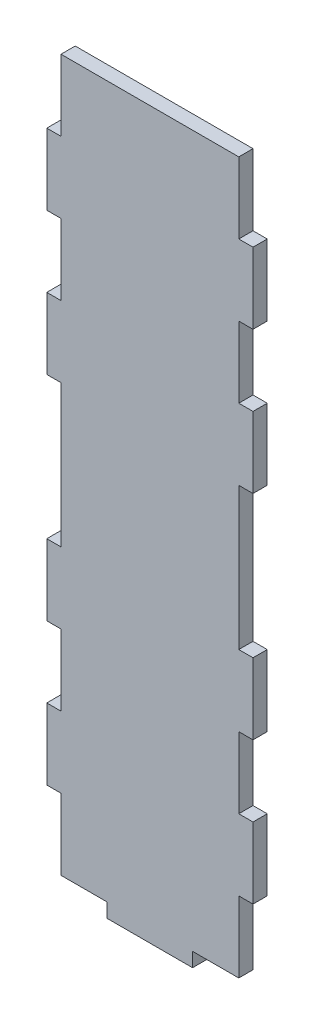
ISO-10303-21;
HEADER;
FILE_DESCRIPTION(('STEP AP214'),'2;1');
FILE_NAME('part.step','',(''),(''),'','','');
FILE_SCHEMA(('AUTOMOTIVE_DESIGN { 1 0 10303 214 1 1 1 1 }'));
ENDSEC;
DATA;
#1=APPLICATION_CONTEXT('core data for automotive mechanical design processes');
#2=APPLICATION_PROTOCOL_DEFINITION('international standard','automotive_design',2000,#1);
#3=PRODUCT_CONTEXT('',#1,'mechanical');
#4=PRODUCT('Part','Part','',(#3));
#5=PRODUCT_RELATED_PRODUCT_CATEGORY('part','',(#4));
#6=PRODUCT_DEFINITION_FORMATION('','',#4);
#7=PRODUCT_DEFINITION_CONTEXT('part definition',#1,'design');
#8=PRODUCT_DEFINITION('design','',#6,#7);
#9=PRODUCT_DEFINITION_SHAPE('','',#8);
#10=(LENGTH_UNIT() NAMED_UNIT(*) SI_UNIT(.MILLI.,.METRE.));
#11=(NAMED_UNIT(*) PLANE_ANGLE_UNIT() SI_UNIT($,.RADIAN.));
#12=(NAMED_UNIT(*) SI_UNIT($,.STERADIAN.) SOLID_ANGLE_UNIT());
#13=UNCERTAINTY_MEASURE_WITH_UNIT(LENGTH_MEASURE(1.E-05),#10,'distance_accuracy_value','');
#14=(GEOMETRIC_REPRESENTATION_CONTEXT(3) GLOBAL_UNCERTAINTY_ASSIGNED_CONTEXT((#13)) GLOBAL_UNIT_ASSIGNED_CONTEXT((#10,
#11,#12)) REPRESENTATION_CONTEXT('',''));
#15=CARTESIAN_POINT('',(0.,0.,0.));
#16=DIRECTION('',(0.,0.,1.));
#17=DIRECTION('',(1.,0.,0.));
#18=AXIS2_PLACEMENT_3D('',#15,#16,#17);
#19=CARTESIAN_POINT('',(-50.,-100.,4.));
#20=DIRECTION('',(1.,0.,0.));
#21=DIRECTION('',(0.,0.,-1.));
#22=AXIS2_PLACEMENT_3D('',#19,#20,#21);
#23=PLANE('',#22);
#24=DIRECTION('',(0.,-1.,0.));
#25=VECTOR('',#24,1.);
#26=CARTESIAN_POINT('',(-50.,-100.,4.));
#27=LINE('',#26,#25);
#28=CARTESIAN_POINT('',(-50.,-40.,4.));
#29=VERTEX_POINT('',#28);
#30=CARTESIAN_POINT('',(-50.,-60.,4.));
#31=VERTEX_POINT('',#30);
#32=EDGE_CURVE('E54',#29,#31,#27,.T.);
#33=ORIENTED_EDGE('',*,*,#32,.F.);
#34=DIRECTION('',(0.,0.,1.));
#35=VECTOR('',#34,1.);
#36=CARTESIAN_POINT('',(-50.,-40.,0.));
#37=LINE('',#36,#35);
#38=CARTESIAN_POINT('',(-50.,-40.,0.));
#39=VERTEX_POINT('',#38);
#40=EDGE_CURVE('E309',#39,#29,#37,.T.);
#41=ORIENTED_EDGE('',*,*,#40,.F.);
#42=DIRECTION('',(0.,-1.,0.));
#43=VECTOR('',#42,1.);
#44=CARTESIAN_POINT('',(-50.,-100.,0.));
#45=LINE('',#44,#43);
#46=CARTESIAN_POINT('',(-50.,-60.,0.));
#47=VERTEX_POINT('',#46);
#48=EDGE_CURVE('E558',#39,#47,#45,.T.);
#49=ORIENTED_EDGE('',*,*,#48,.T.);
#50=DIRECTION('',(0.,0.,1.));
#51=VECTOR('',#50,1.);
#52=CARTESIAN_POINT('',(-50.,-60.,0.));
#53=LINE('',#52,#51);
#54=EDGE_CURVE('E331',#47,#31,#53,.T.);
#55=ORIENTED_EDGE('',*,*,#54,.T.);
#56=EDGE_LOOP('',(#33,#41,#49,#55));
#57=FACE_BOUND('',#56,.T.);
#58=ADVANCED_FACE('F39',(#57),#23,.F.);
#59=CARTESIAN_POINT('',(-50.,-80.,4.));
#60=VERTEX_POINT('',#59);
#61=CARTESIAN_POINT('',(-50.,-100.,4.));
#62=VERTEX_POINT('',#61);
#63=EDGE_CURVE('E533',#60,#62,#27,.T.);
#64=ORIENTED_EDGE('',*,*,#63,.F.);
#65=DIRECTION('',(0.,0.,1.));
#66=VECTOR('',#65,1.);
#67=CARTESIAN_POINT('',(-50.,-80.,0.));
#68=LINE('',#67,#66);
#69=CARTESIAN_POINT('',(-50.,-80.,0.));
#70=VERTEX_POINT('',#69);
#71=EDGE_CURVE('E327',#70,#60,#68,.T.);
#72=ORIENTED_EDGE('',*,*,#71,.F.);
#73=CARTESIAN_POINT('',(-50.,-100.,0.));
#74=VERTEX_POINT('',#73);
#75=EDGE_CURVE('E552',#70,#74,#45,.T.);
#76=ORIENTED_EDGE('',*,*,#75,.T.);
#77=DIRECTION('',(0.,0.,-1.));
#78=VECTOR('',#77,1.);
#79=CARTESIAN_POINT('',(-50.,-100.,4.));
#80=LINE('',#79,#78);
#81=EDGE_CURVE('E47',#62,#74,#80,.T.);
#82=ORIENTED_EDGE('',*,*,#81,.F.);
#83=EDGE_LOOP('',(#64,#72,#76,#82));
#84=FACE_BOUND('',#83,.T.);
#85=ADVANCED_FACE('F635',(#84),#23,.F.);
#86=CARTESIAN_POINT('',(-50.,20.,0.));
#87=VERTEX_POINT('',#86);
#88=CARTESIAN_POINT('',(-50.,-20.,0.));
#89=VERTEX_POINT('',#88);
#90=EDGE_CURVE('E626',#87,#89,#45,.T.);
#91=ORIENTED_EDGE('',*,*,#90,.T.);
#92=DIRECTION('',(0.,0.,1.));
#93=VECTOR('',#92,1.);
#94=CARTESIAN_POINT('',(-50.,-20.,0.));
#95=LINE('',#94,#93);
#96=CARTESIAN_POINT('',(-50.,-20.,4.));
#97=VERTEX_POINT('',#96);
#98=EDGE_CURVE('E62',#89,#97,#95,.T.);
#99=ORIENTED_EDGE('',*,*,#98,.T.);
#100=CARTESIAN_POINT('',(-50.,20.,4.));
#101=VERTEX_POINT('',#100);
#102=EDGE_CURVE('E605',#101,#97,#27,.T.);
#103=ORIENTED_EDGE('',*,*,#102,.F.);
#104=DIRECTION('',(0.,0.,1.));
#105=VECTOR('',#104,1.);
#106=CARTESIAN_POINT('',(-50.,20.,0.));
#107=LINE('',#106,#105);
#108=EDGE_CURVE('E350',#87,#101,#107,.T.);
#109=ORIENTED_EDGE('',*,*,#108,.F.);
#110=EDGE_LOOP('',(#91,#99,#103,#109));
#111=FACE_BOUND('',#110,.T.);
#112=ADVANCED_FACE('F625',(#111),#23,.F.);
#113=CARTESIAN_POINT('',(-50.,60.,0.));
#114=VERTEX_POINT('',#113);
#115=CARTESIAN_POINT('',(-50.,40.,0.));
#116=VERTEX_POINT('',#115);
#117=EDGE_CURVE('E557',#114,#116,#45,.T.);
#118=ORIENTED_EDGE('',*,*,#117,.T.);
#119=DIRECTION('',(0.,0.,1.));
#120=VECTOR('',#119,1.);
#121=CARTESIAN_POINT('',(-50.,40.,0.));
#122=LINE('',#121,#120);
#123=CARTESIAN_POINT('',(-50.,40.,4.));
#124=VERTEX_POINT('',#123);
#125=EDGE_CURVE('E358',#116,#124,#122,.T.);
#126=ORIENTED_EDGE('',*,*,#125,.T.);
#127=CARTESIAN_POINT('',(-50.,60.,4.));
#128=VERTEX_POINT('',#127);
#129=EDGE_CURVE('E539',#128,#124,#27,.T.);
#130=ORIENTED_EDGE('',*,*,#129,.F.);
#131=DIRECTION('',(0.,0.,1.));
#132=VECTOR('',#131,1.);
#133=CARTESIAN_POINT('',(-50.,60.,0.));
#134=LINE('',#133,#132);
#135=EDGE_CURVE('E402',#114,#128,#134,.T.);
#136=ORIENTED_EDGE('',*,*,#135,.F.);
#137=EDGE_LOOP('',(#118,#126,#130,#136));
#138=FACE_BOUND('',#137,.T.);
#139=ADVANCED_FACE('F644',(#138),#23,.F.);
#140=CARTESIAN_POINT('',(-50.,100.,4.));
#141=DIRECTION('',(0.,-1.,0.));
#142=DIRECTION('',(1.,0.,0.));
#143=AXIS2_PLACEMENT_3D('',#140,#141,#142);
#144=PLANE('',#143);
#145=DIRECTION('',(0.,0.,1.));
#146=VECTOR('',#145,1.);
#147=CARTESIAN_POINT('',(0.,100.,0.));
#148=LINE('',#147,#146);
#149=CARTESIAN_POINT('',(0.,100.,0.));
#150=VERTEX_POINT('',#149);
#151=CARTESIAN_POINT('',(0.,100.,4.));
#152=VERTEX_POINT('',#151);
#153=EDGE_CURVE('E511',#150,#152,#148,.T.);
#154=ORIENTED_EDGE('',*,*,#153,.F.);
#155=DIRECTION('',(-1.,0.,0.));
#156=VECTOR('',#155,1.);
#157=CARTESIAN_POINT('',(-50.,100.,0.));
#158=LINE('',#157,#156);
#159=CARTESIAN_POINT('',(-50.,100.,0.));
#160=VERTEX_POINT('',#159);
#161=EDGE_CURVE('E496',#150,#160,#158,.T.);
#162=ORIENTED_EDGE('',*,*,#161,.T.);
#163=DIRECTION('',(0.,0.,-1.));
#164=VECTOR('',#163,1.);
#165=CARTESIAN_POINT('',(-50.,100.,4.));
#166=LINE('',#165,#164);
#167=CARTESIAN_POINT('',(-50.,100.,4.));
#168=VERTEX_POINT('',#167);
#169=EDGE_CURVE('E11',#168,#160,#166,.T.);
#170=ORIENTED_EDGE('',*,*,#169,.F.);
#171=DIRECTION('',(-1.,0.,0.));
#172=VECTOR('',#171,1.);
#173=CARTESIAN_POINT('',(-50.,100.,4.));
#174=LINE('',#173,#172);
#175=EDGE_CURVE('E531',#152,#168,#174,.T.);
#176=ORIENTED_EDGE('',*,*,#175,.F.);
#177=EDGE_LOOP('',(#154,#162,#170,#176));
#178=FACE_BOUND('',#177,.T.);
#179=ADVANCED_FACE('F41',(#178),#144,.F.);
#180=CARTESIAN_POINT('',(-13.,-100.,4.));
#181=DIRECTION('',(0.,1.,0.));
#182=DIRECTION('',(0.,0.,1.));
#183=AXIS2_PLACEMENT_3D('',#180,#181,#182);
#184=PLANE('',#183);
#185=DIRECTION('',(0.,0.,1.));
#186=VECTOR('',#185,1.);
#187=CARTESIAN_POINT('',(0.,-100.,0.));
#188=LINE('',#187,#186);
#189=CARTESIAN_POINT('',(0.,-100.,0.));
#190=VERTEX_POINT('',#189);
#191=CARTESIAN_POINT('',(0.,-100.,4.));
#192=VERTEX_POINT('',#191);
#193=EDGE_CURVE('E513',#190,#192,#188,.T.);
#194=ORIENTED_EDGE('',*,*,#193,.T.);
#195=DIRECTION('',(1.,0.,0.));
#196=VECTOR('',#195,1.);
#197=CARTESIAN_POINT('',(-13.,-100.,4.));
#198=LINE('',#197,#196);
#199=CARTESIAN_POINT('',(-13.,-100.,4.));
#200=VERTEX_POINT('',#199);
#201=EDGE_CURVE('E547',#200,#192,#198,.T.);
#202=ORIENTED_EDGE('',*,*,#201,.F.);
#203=DIRECTION('',(0.,0.,-1.));
#204=VECTOR('',#203,1.);
#205=CARTESIAN_POINT('',(-13.,-100.,4.));
#206=LINE('',#205,#204);
#207=CARTESIAN_POINT('',(-13.,-100.,0.));
#208=VERTEX_POINT('',#207);
#209=EDGE_CURVE('E550',#200,#208,#206,.T.);
#210=ORIENTED_EDGE('',*,*,#209,.T.);
#211=DIRECTION('',(1.,0.,0.));
#212=VECTOR('',#211,1.);
#213=CARTESIAN_POINT('',(-13.,-100.,0.));
#214=LINE('',#213,#212);
#215=EDGE_CURVE('E534',#208,#190,#214,.T.);
#216=ORIENTED_EDGE('',*,*,#215,.T.);
#217=EDGE_LOOP('',(#194,#202,#210,#216));
#218=FACE_BOUND('',#217,.T.);
#219=ADVANCED_FACE('F657',(#218),#184,.F.);
#220=CARTESIAN_POINT('',(0.,0.,4.));
#221=DIRECTION('',(0.,0.,-1.));
#222=DIRECTION('',(-1.,0.,0.));
#223=AXIS2_PLACEMENT_3D('',#220,#221,#222);
#224=PLANE('',#223);
#225=DIRECTION('',(0.,1.,0.));
#226=VECTOR('',#225,1.);
#227=CARTESIAN_POINT('',(0.,0.,4.));
#228=LINE('',#227,#226);
#229=CARTESIAN_POINT('',(0.,80.,4.));
#230=VERTEX_POINT('',#229);
#231=EDGE_CURVE('E455',#230,#152,#228,.T.);
#232=ORIENTED_EDGE('',*,*,#231,.T.);
#233=ORIENTED_EDGE('',*,*,#175,.T.);
#234=CARTESIAN_POINT('',(-50.,80.,4.));
#235=VERTEX_POINT('',#234);
#236=EDGE_CURVE('E535',#168,#235,#27,.T.);
#237=ORIENTED_EDGE('',*,*,#236,.T.);
#238=DIRECTION('',(-1.,0.,0.));
#239=VECTOR('',#238,1.);
#240=CARTESIAN_POINT('',(-50.,80.,4.));
#241=LINE('',#240,#239);
#242=CARTESIAN_POINT('',(-54.,80.,4.));
#243=VERTEX_POINT('',#242);
#244=EDGE_CURVE('E377',#235,#243,#241,.T.);
#245=ORIENTED_EDGE('',*,*,#244,.T.);
#246=DIRECTION('',(0.,-1.,0.));
#247=VECTOR('',#246,1.);
#248=CARTESIAN_POINT('',(-54.,80.,4.));
#249=LINE('',#248,#247);
#250=CARTESIAN_POINT('',(-54.,60.,4.));
#251=VERTEX_POINT('',#250);
#252=EDGE_CURVE('E397',#243,#251,#249,.T.);
#253=ORIENTED_EDGE('',*,*,#252,.T.);
#254=DIRECTION('',(1.,0.,0.));
#255=VECTOR('',#254,1.);
#256=CARTESIAN_POINT('',(-54.,60.,4.));
#257=LINE('',#256,#255);
#258=EDGE_CURVE('E389',#251,#128,#257,.T.);
#259=ORIENTED_EDGE('',*,*,#258,.T.);
#260=ORIENTED_EDGE('',*,*,#129,.T.);
#261=DIRECTION('',(-1.,0.,0.));
#262=VECTOR('',#261,1.);
#263=CARTESIAN_POINT('',(-50.,40.,4.));
#264=LINE('',#263,#262);
#265=CARTESIAN_POINT('',(-54.,40.,4.));
#266=VERTEX_POINT('',#265);
#267=EDGE_CURVE('E374',#124,#266,#264,.T.);
#268=ORIENTED_EDGE('',*,*,#267,.T.);
#269=DIRECTION('',(0.,-1.,0.));
#270=VECTOR('',#269,1.);
#271=CARTESIAN_POINT('',(-54.,40.,4.));
#272=LINE('',#271,#270);
#273=CARTESIAN_POINT('',(-54.,20.,4.));
#274=VERTEX_POINT('',#273);
#275=EDGE_CURVE('E370',#266,#274,#272,.T.);
#276=ORIENTED_EDGE('',*,*,#275,.T.);
#277=DIRECTION('',(1.,0.,0.));
#278=VECTOR('',#277,1.);
#279=CARTESIAN_POINT('',(-54.,20.,4.));
#280=LINE('',#279,#278);
#281=EDGE_CURVE('E367',#274,#101,#280,.T.);
#282=ORIENTED_EDGE('',*,*,#281,.T.);
#283=ORIENTED_EDGE('',*,*,#102,.T.);
#284=DIRECTION('',(-1.,0.,0.));
#285=VECTOR('',#284,1.);
#286=CARTESIAN_POINT('',(-54.,-20.,4.));
#287=LINE('',#286,#285);
#288=CARTESIAN_POINT('',(-54.,-20.,4.));
#289=VERTEX_POINT('',#288);
#290=EDGE_CURVE('E317',#97,#289,#287,.T.);
#291=ORIENTED_EDGE('',*,*,#290,.T.);
#292=DIRECTION('',(0.,-1.,0.));
#293=VECTOR('',#292,1.);
#294=CARTESIAN_POINT('',(-54.,-40.,4.));
#295=LINE('',#294,#293);
#296=CARTESIAN_POINT('',(-54.,-40.,4.));
#297=VERTEX_POINT('',#296);
#298=EDGE_CURVE('E300',#289,#297,#295,.T.);
#299=ORIENTED_EDGE('',*,*,#298,.T.);
#300=DIRECTION('',(1.,0.,0.));
#301=VECTOR('',#300,1.);
#302=CARTESIAN_POINT('',(-50.,-40.,4.));
#303=LINE('',#302,#301);
#304=EDGE_CURVE('E315',#297,#29,#303,.T.);
#305=ORIENTED_EDGE('',*,*,#304,.T.);
#306=ORIENTED_EDGE('',*,*,#32,.T.);
#307=DIRECTION('',(-1.,0.,0.));
#308=VECTOR('',#307,1.);
#309=CARTESIAN_POINT('',(-54.,-60.,4.));
#310=LINE('',#309,#308);
#311=CARTESIAN_POINT('',(-54.,-60.,4.));
#312=VERTEX_POINT('',#311);
#313=EDGE_CURVE('E347',#31,#312,#310,.T.);
#314=ORIENTED_EDGE('',*,*,#313,.T.);
#315=DIRECTION('',(0.,-1.,0.));
#316=VECTOR('',#315,1.);
#317=CARTESIAN_POINT('',(-54.,-80.,4.));
#318=LINE('',#317,#316);
#319=CARTESIAN_POINT('',(-54.,-80.,4.));
#320=VERTEX_POINT('',#319);
#321=EDGE_CURVE('E343',#312,#320,#318,.T.);
#322=ORIENTED_EDGE('',*,*,#321,.T.);
#323=DIRECTION('',(1.,0.,0.));
#324=VECTOR('',#323,1.);
#325=CARTESIAN_POINT('',(-50.,-80.,4.));
#326=LINE('',#325,#324);
#327=EDGE_CURVE('E340',#320,#60,#326,.T.);
#328=ORIENTED_EDGE('',*,*,#327,.T.);
#329=ORIENTED_EDGE('',*,*,#63,.T.);
#330=DIRECTION('',(1.,0.,0.));
#331=VECTOR('',#330,1.);
#332=CARTESIAN_POINT('',(-50.,-100.,4.));
#333=LINE('',#332,#331);
#334=CARTESIAN_POINT('',(-37.,-100.,4.));
#335=VERTEX_POINT('',#334);
#336=EDGE_CURVE('E538',#62,#335,#333,.T.);
#337=ORIENTED_EDGE('',*,*,#336,.T.);
#338=DIRECTION('',(0.,-1.,0.));
#339=VECTOR('',#338,1.);
#340=CARTESIAN_POINT('',(-37.,-100.,4.));
#341=LINE('',#340,#339);
#342=CARTESIAN_POINT('',(-37.,-104.,4.));
#343=VERTEX_POINT('',#342);
#344=EDGE_CURVE('E541',#335,#343,#341,.T.);
#345=ORIENTED_EDGE('',*,*,#344,.T.);
#346=DIRECTION('',(1.,0.,0.));
#347=VECTOR('',#346,1.);
#348=CARTESIAN_POINT('',(-37.,-104.,4.));
#349=LINE('',#348,#347);
#350=CARTESIAN_POINT('',(-13.,-104.,4.));
#351=VERTEX_POINT('',#350);
#352=EDGE_CURVE('E543',#343,#351,#349,.T.);
#353=ORIENTED_EDGE('',*,*,#352,.T.);
#354=DIRECTION('',(0.,1.,0.));
#355=VECTOR('',#354,1.);
#356=CARTESIAN_POINT('',(-13.,-104.,4.));
#357=LINE('',#356,#355);
#358=EDGE_CURVE('E545',#351,#200,#357,.T.);
#359=ORIENTED_EDGE('',*,*,#358,.T.);
#360=ORIENTED_EDGE('',*,*,#201,.T.);
#361=DIRECTION('',(0.,1.,0.));
#362=VECTOR('',#361,1.);
#363=CARTESIAN_POINT('',(0.,0.,4.));
#364=LINE('',#363,#362);
#365=CARTESIAN_POINT('',(0.,-80.,4.));
#366=VERTEX_POINT('',#365);
#367=EDGE_CURVE('E468',#192,#366,#364,.T.);
#368=ORIENTED_EDGE('',*,*,#367,.T.);
#369=DIRECTION('',(1.,0.,0.));
#370=VECTOR('',#369,1.);
#371=CARTESIAN_POINT('',(0.,-80.,4.));
#372=LINE('',#371,#370);
#373=CARTESIAN_POINT('',(4.00000000000003,-80.,4.));
#374=VERTEX_POINT('',#373);
#375=EDGE_CURVE('E474',#366,#374,#372,.T.);
#376=ORIENTED_EDGE('',*,*,#375,.T.);
#377=DIRECTION('',(0.,1.,0.));
#378=VECTOR('',#377,1.);
#379=CARTESIAN_POINT('',(3.99999999999998,0.,4.));
#380=LINE('',#379,#378);
#381=CARTESIAN_POINT('',(4.00000000000002,-60.,4.));
#382=VERTEX_POINT('',#381);
#383=EDGE_CURVE('E471',#374,#382,#380,.T.);
#384=ORIENTED_EDGE('',*,*,#383,.T.);
#385=DIRECTION('',(-1.,0.,0.));
#386=VECTOR('',#385,1.);
#387=CARTESIAN_POINT('',(0.,-60.,4.));
#388=LINE('',#387,#386);
#389=CARTESIAN_POINT('',(0.,-60.,4.));
#390=VERTEX_POINT('',#389);
#391=EDGE_CURVE('E467',#382,#390,#388,.T.);
#392=ORIENTED_EDGE('',*,*,#391,.T.);
#393=CARTESIAN_POINT('',(0.,-40.,4.));
#394=VERTEX_POINT('',#393);
#395=EDGE_CURVE('E464',#390,#394,#364,.T.);
#396=ORIENTED_EDGE('',*,*,#395,.T.);
#397=DIRECTION('',(1.,0.,0.));
#398=VECTOR('',#397,1.);
#399=CARTESIAN_POINT('',(0.,-40.,4.));
#400=LINE('',#399,#398);
#401=CARTESIAN_POINT('',(4.00000000000002,-40.,4.));
#402=VERTEX_POINT('',#401);
#403=EDGE_CURVE('E461',#394,#402,#400,.T.);
#404=ORIENTED_EDGE('',*,*,#403,.T.);
#405=DIRECTION('',(0.,1.,0.));
#406=VECTOR('',#405,1.);
#407=CARTESIAN_POINT('',(4.,0.,4.));
#408=LINE('',#407,#406);
#409=CARTESIAN_POINT('',(4.00000000000001,-20.,4.));
#410=VERTEX_POINT('',#409);
#411=EDGE_CURVE('E458',#402,#410,#408,.T.);
#412=ORIENTED_EDGE('',*,*,#411,.T.);
#413=DIRECTION('',(-1.,0.,0.));
#414=VECTOR('',#413,1.);
#415=CARTESIAN_POINT('',(0.,-20.,4.));
#416=LINE('',#415,#414);
#417=CARTESIAN_POINT('',(0.,-20.,4.));
#418=VERTEX_POINT('',#417);
#419=EDGE_CURVE('E453',#410,#418,#416,.T.);
#420=ORIENTED_EDGE('',*,*,#419,.T.);
#421=CARTESIAN_POINT('',(0.,20.,4.));
#422=VERTEX_POINT('',#421);
#423=EDGE_CURVE('E404',#418,#422,#228,.T.);
#424=ORIENTED_EDGE('',*,*,#423,.T.);
#425=DIRECTION('',(-1.,0.,0.));
#426=VECTOR('',#425,1.);
#427=CARTESIAN_POINT('',(0.,20.,4.));
#428=LINE('',#427,#426);
#429=CARTESIAN_POINT('',(4.00000000000001,20.,4.));
#430=VERTEX_POINT('',#429);
#431=EDGE_CURVE('E414',#430,#422,#428,.T.);
#432=ORIENTED_EDGE('',*,*,#431,.F.);
#433=DIRECTION('',(0.,-1.,0.));
#434=VECTOR('',#433,1.);
#435=CARTESIAN_POINT('',(4.00000000000001,0.,4.));
#436=LINE('',#435,#434);
#437=CARTESIAN_POINT('',(4.00000000000001,40.,4.));
#438=VERTEX_POINT('',#437);
#439=EDGE_CURVE('E489',#438,#430,#436,.T.);
#440=ORIENTED_EDGE('',*,*,#439,.F.);
#441=DIRECTION('',(1.,0.,0.));
#442=VECTOR('',#441,1.);
#443=CARTESIAN_POINT('',(0.,40.,4.));
#444=LINE('',#443,#442);
#445=CARTESIAN_POINT('',(0.,40.,4.));
#446=VERTEX_POINT('',#445);
#447=EDGE_CURVE('E486',#446,#438,#444,.T.);
#448=ORIENTED_EDGE('',*,*,#447,.F.);
#449=CARTESIAN_POINT('',(0.,60.,4.));
#450=VERTEX_POINT('',#449);
#451=EDGE_CURVE('E454',#446,#450,#228,.T.);
#452=ORIENTED_EDGE('',*,*,#451,.T.);
#453=DIRECTION('',(-1.,0.,0.));
#454=VECTOR('',#453,1.);
#455=CARTESIAN_POINT('',(0.,60.,4.));
#456=LINE('',#455,#454);
#457=CARTESIAN_POINT('',(4.,60.,4.));
#458=VERTEX_POINT('',#457);
#459=EDGE_CURVE('E483',#458,#450,#456,.T.);
#460=ORIENTED_EDGE('',*,*,#459,.F.);
#461=DIRECTION('',(0.,-1.,0.));
#462=VECTOR('',#461,1.);
#463=CARTESIAN_POINT('',(4.00000000000001,0.,4.));
#464=LINE('',#463,#462);
#465=CARTESIAN_POINT('',(4.,80.,4.));
#466=VERTEX_POINT('',#465);
#467=EDGE_CURVE('E480',#466,#458,#464,.T.);
#468=ORIENTED_EDGE('',*,*,#467,.F.);
#469=DIRECTION('',(1.,0.,0.));
#470=VECTOR('',#469,1.);
#471=CARTESIAN_POINT('',(0.,80.,4.));
#472=LINE('',#471,#470);
#473=EDGE_CURVE('E477',#230,#466,#472,.T.);
#474=ORIENTED_EDGE('',*,*,#473,.F.);
#475=EDGE_LOOP('',(#232,#233,#237,#245,#253,#259,#260,#268,#276,#282,#283,#291,#299,#305,#306,
#314,#322,#328,#329,#337,#345,#353,#359,#360,#368,#376,#384,#392,#396,#404,#412,#420,#424,#432,
#440,#448,#452,#460,#468,#474));
#476=FACE_BOUND('',#475,.T.);
#477=ADVANCED_FACE('F314',(#476),#224,.F.);
#478=CARTESIAN_POINT('',(0.,0.,0.));
#479=DIRECTION('',(0.,0.,-1.));
#480=DIRECTION('',(-1.,0.,0.));
#481=AXIS2_PLACEMENT_3D('',#478,#479,#480);
#482=PLANE('',#481);
#483=ORIENTED_EDGE('',*,*,#161,.F.);
#484=DIRECTION('',(0.,1.,0.));
#485=VECTOR('',#484,1.);
#486=CARTESIAN_POINT('',(0.,0.,0.));
#487=LINE('',#486,#485);
#488=CARTESIAN_POINT('',(0.,80.,0.));
#489=VERTEX_POINT('',#488);
#490=EDGE_CURVE('E416',#489,#150,#487,.T.);
#491=ORIENTED_EDGE('',*,*,#490,.F.);
#492=DIRECTION('',(1.,0.,0.));
#493=VECTOR('',#492,1.);
#494=CARTESIAN_POINT('',(0.,80.,0.));
#495=LINE('',#494,#493);
#496=CARTESIAN_POINT('',(4.,80.,0.));
#497=VERTEX_POINT('',#496);
#498=EDGE_CURVE('E432',#489,#497,#495,.T.);
#499=ORIENTED_EDGE('',*,*,#498,.T.);
#500=DIRECTION('',(0.,-1.,0.));
#501=VECTOR('',#500,1.);
#502=CARTESIAN_POINT('',(4.00000000000001,0.,0.));
#503=LINE('',#502,#501);
#504=CARTESIAN_POINT('',(4.,60.,0.));
#505=VERTEX_POINT('',#504);
#506=EDGE_CURVE('E435',#497,#505,#503,.T.);
#507=ORIENTED_EDGE('',*,*,#506,.T.);
#508=DIRECTION('',(-1.,0.,0.));
#509=VECTOR('',#508,1.);
#510=CARTESIAN_POINT('',(0.,60.,0.));
#511=LINE('',#510,#509);
#512=CARTESIAN_POINT('',(0.,60.,0.));
#513=VERTEX_POINT('',#512);
#514=EDGE_CURVE('E438',#505,#513,#511,.T.);
#515=ORIENTED_EDGE('',*,*,#514,.T.);
#516=CARTESIAN_POINT('',(0.,40.,0.));
#517=VERTEX_POINT('',#516);
#518=EDGE_CURVE('E415',#517,#513,#487,.T.);
#519=ORIENTED_EDGE('',*,*,#518,.F.);
#520=DIRECTION('',(1.,0.,0.));
#521=VECTOR('',#520,1.);
#522=CARTESIAN_POINT('',(0.,40.,0.));
#523=LINE('',#522,#521);
#524=CARTESIAN_POINT('',(4.00000000000001,40.,0.));
#525=VERTEX_POINT('',#524);
#526=EDGE_CURVE('E441',#517,#525,#523,.T.);
#527=ORIENTED_EDGE('',*,*,#526,.T.);
#528=DIRECTION('',(0.,-1.,0.));
#529=VECTOR('',#528,1.);
#530=CARTESIAN_POINT('',(4.00000000000001,0.,0.));
#531=LINE('',#530,#529);
#532=CARTESIAN_POINT('',(4.00000000000001,20.,0.));
#533=VERTEX_POINT('',#532);
#534=EDGE_CURVE('E444',#525,#533,#531,.T.);
#535=ORIENTED_EDGE('',*,*,#534,.T.);
#536=DIRECTION('',(-1.,0.,0.));
#537=VECTOR('',#536,1.);
#538=CARTESIAN_POINT('',(0.,20.,0.));
#539=LINE('',#538,#537);
#540=CARTESIAN_POINT('',(0.,20.,0.));
#541=VERTEX_POINT('',#540);
#542=EDGE_CURVE('E447',#533,#541,#539,.T.);
#543=ORIENTED_EDGE('',*,*,#542,.T.);
#544=CARTESIAN_POINT('',(0.,-20.,0.));
#545=VERTEX_POINT('',#544);
#546=EDGE_CURVE('E411',#545,#541,#487,.T.);
#547=ORIENTED_EDGE('',*,*,#546,.F.);
#548=DIRECTION('',(-1.,0.,0.));
#549=VECTOR('',#548,1.);
#550=CARTESIAN_POINT('',(0.,-20.,0.));
#551=LINE('',#550,#549);
#552=CARTESIAN_POINT('',(4.00000000000001,-20.,0.));
#553=VERTEX_POINT('',#552);
#554=EDGE_CURVE('E413',#553,#545,#551,.T.);
#555=ORIENTED_EDGE('',*,*,#554,.F.);
#556=DIRECTION('',(0.,1.,0.));
#557=VECTOR('',#556,1.);
#558=CARTESIAN_POINT('',(4.,0.,0.));
#559=LINE('',#558,#557);
#560=CARTESIAN_POINT('',(4.00000000000002,-40.,0.));
#561=VERTEX_POINT('',#560);
#562=EDGE_CURVE('E418',#561,#553,#559,.T.);
#563=ORIENTED_EDGE('',*,*,#562,.F.);
#564=DIRECTION('',(1.,0.,0.));
#565=VECTOR('',#564,1.);
#566=CARTESIAN_POINT('',(0.,-40.,0.));
#567=LINE('',#566,#565);
#568=CARTESIAN_POINT('',(0.,-40.,0.));
#569=VERTEX_POINT('',#568);
#570=EDGE_CURVE('E421',#569,#561,#567,.T.);
#571=ORIENTED_EDGE('',*,*,#570,.F.);
#572=DIRECTION('',(0.,1.,0.));
#573=VECTOR('',#572,1.);
#574=CARTESIAN_POINT('',(0.,0.,0.));
#575=LINE('',#574,#573);
#576=CARTESIAN_POINT('',(0.,-60.,0.));
#577=VERTEX_POINT('',#576);
#578=EDGE_CURVE('E423',#577,#569,#575,.T.);
#579=ORIENTED_EDGE('',*,*,#578,.F.);
#580=DIRECTION('',(-1.,0.,0.));
#581=VECTOR('',#580,1.);
#582=CARTESIAN_POINT('',(0.,-60.,0.));
#583=LINE('',#582,#581);
#584=CARTESIAN_POINT('',(4.00000000000002,-60.,0.));
#585=VERTEX_POINT('',#584);
#586=EDGE_CURVE('E425',#585,#577,#583,.T.);
#587=ORIENTED_EDGE('',*,*,#586,.F.);
#588=DIRECTION('',(0.,1.,0.));
#589=VECTOR('',#588,1.);
#590=CARTESIAN_POINT('',(3.99999999999998,0.,0.));
#591=LINE('',#590,#589);
#592=CARTESIAN_POINT('',(4.00000000000003,-80.,0.));
#593=VERTEX_POINT('',#592);
#594=EDGE_CURVE('E428',#593,#585,#591,.T.);
#595=ORIENTED_EDGE('',*,*,#594,.F.);
#596=DIRECTION('',(1.,0.,0.));
#597=VECTOR('',#596,1.);
#598=CARTESIAN_POINT('',(0.,-80.,0.));
#599=LINE('',#598,#597);
#600=CARTESIAN_POINT('',(0.,-80.,0.));
#601=VERTEX_POINT('',#600);
#602=EDGE_CURVE('E430',#601,#593,#599,.T.);
#603=ORIENTED_EDGE('',*,*,#602,.F.);
#604=EDGE_CURVE('E426',#190,#601,#575,.T.);
#605=ORIENTED_EDGE('',*,*,#604,.F.);
#606=ORIENTED_EDGE('',*,*,#215,.F.);
#607=DIRECTION('',(0.,1.,0.));
#608=VECTOR('',#607,1.);
#609=CARTESIAN_POINT('',(-13.,-104.,0.));
#610=LINE('',#609,#608);
#611=CARTESIAN_POINT('',(-13.,-104.,0.));
#612=VERTEX_POINT('',#611);
#613=EDGE_CURVE('E564',#612,#208,#610,.T.);
#614=ORIENTED_EDGE('',*,*,#613,.F.);
#615=DIRECTION('',(1.,0.,0.));
#616=VECTOR('',#615,1.);
#617=CARTESIAN_POINT('',(-37.,-104.,0.));
#618=LINE('',#617,#616);
#619=CARTESIAN_POINT('',(-37.,-104.,0.));
#620=VERTEX_POINT('',#619);
#621=EDGE_CURVE('E562',#620,#612,#618,.T.);
#622=ORIENTED_EDGE('',*,*,#621,.F.);
#623=DIRECTION('',(0.,-1.,0.));
#624=VECTOR('',#623,1.);
#625=CARTESIAN_POINT('',(-37.,-100.,0.));
#626=LINE('',#625,#624);
#627=CARTESIAN_POINT('',(-37.,-100.,0.));
#628=VERTEX_POINT('',#627);
#629=EDGE_CURVE('E560',#628,#620,#626,.T.);
#630=ORIENTED_EDGE('',*,*,#629,.F.);
#631=DIRECTION('',(1.,0.,0.));
#632=VECTOR('',#631,1.);
#633=CARTESIAN_POINT('',(-50.,-100.,0.));
#634=LINE('',#633,#632);
#635=EDGE_CURVE('E556',#74,#628,#634,.T.);
#636=ORIENTED_EDGE('',*,*,#635,.F.);
#637=ORIENTED_EDGE('',*,*,#75,.F.);
#638=DIRECTION('',(1.,0.,0.));
#639=VECTOR('',#638,1.);
#640=CARTESIAN_POINT('',(-50.,-80.,0.));
#641=LINE('',#640,#639);
#642=CARTESIAN_POINT('',(-54.,-80.,0.));
#643=VERTEX_POINT('',#642);
#644=EDGE_CURVE('E333',#643,#70,#641,.T.);
#645=ORIENTED_EDGE('',*,*,#644,.F.);
#646=DIRECTION('',(0.,-1.,0.));
#647=VECTOR('',#646,1.);
#648=CARTESIAN_POINT('',(-54.,-80.,0.));
#649=LINE('',#648,#647);
#650=CARTESIAN_POINT('',(-54.,-60.,0.));
#651=VERTEX_POINT('',#650);
#652=EDGE_CURVE('E353',#651,#643,#649,.T.);
#653=ORIENTED_EDGE('',*,*,#652,.F.);
#654=DIRECTION('',(-1.,0.,0.));
#655=VECTOR('',#654,1.);
#656=CARTESIAN_POINT('',(-54.,-60.,0.));
#657=LINE('',#656,#655);
#658=EDGE_CURVE('E344',#47,#651,#657,.T.);
#659=ORIENTED_EDGE('',*,*,#658,.F.);
#660=ORIENTED_EDGE('',*,*,#48,.F.);
#661=DIRECTION('',(1.,0.,0.));
#662=VECTOR('',#661,1.);
#663=CARTESIAN_POINT('',(-50.,-40.,0.));
#664=LINE('',#663,#662);
#665=CARTESIAN_POINT('',(-54.,-40.,0.));
#666=VERTEX_POINT('',#665);
#667=EDGE_CURVE('E328',#666,#39,#664,.T.);
#668=ORIENTED_EDGE('',*,*,#667,.F.);
#669=DIRECTION('',(0.,-1.,0.));
#670=VECTOR('',#669,1.);
#671=CARTESIAN_POINT('',(-54.,-40.,0.));
#672=LINE('',#671,#670);
#673=CARTESIAN_POINT('',(-54.,-20.,0.));
#674=VERTEX_POINT('',#673);
#675=EDGE_CURVE('E303',#674,#666,#672,.T.);
#676=ORIENTED_EDGE('',*,*,#675,.F.);
#677=DIRECTION('',(-1.,0.,0.));
#678=VECTOR('',#677,1.);
#679=CARTESIAN_POINT('',(-54.,-20.,0.));
#680=LINE('',#679,#678);
#681=EDGE_CURVE('E320',#89,#674,#680,.T.);
#682=ORIENTED_EDGE('',*,*,#681,.F.);
#683=ORIENTED_EDGE('',*,*,#90,.F.);
#684=DIRECTION('',(1.,0.,0.));
#685=VECTOR('',#684,1.);
#686=CARTESIAN_POINT('',(-54.,20.,0.));
#687=LINE('',#686,#685);
#688=CARTESIAN_POINT('',(-54.,20.,0.));
#689=VERTEX_POINT('',#688);
#690=EDGE_CURVE('E360',#689,#87,#687,.T.);
#691=ORIENTED_EDGE('',*,*,#690,.F.);
#692=DIRECTION('',(0.,-1.,0.));
#693=VECTOR('',#692,1.);
#694=CARTESIAN_POINT('',(-54.,40.,0.));
#695=LINE('',#694,#693);
#696=CARTESIAN_POINT('',(-54.,40.,0.));
#697=VERTEX_POINT('',#696);
#698=EDGE_CURVE('E380',#697,#689,#695,.T.);
#699=ORIENTED_EDGE('',*,*,#698,.F.);
#700=DIRECTION('',(-1.,0.,0.));
#701=VECTOR('',#700,1.);
#702=CARTESIAN_POINT('',(-50.,40.,0.));
#703=LINE('',#702,#701);
#704=EDGE_CURVE('E371',#116,#697,#703,.T.);
#705=ORIENTED_EDGE('',*,*,#704,.F.);
#706=ORIENTED_EDGE('',*,*,#117,.F.);
#707=DIRECTION('',(1.,0.,0.));
#708=VECTOR('',#707,1.);
#709=CARTESIAN_POINT('',(-54.,60.,0.));
#710=LINE('',#709,#708);
#711=CARTESIAN_POINT('',(-54.,60.,0.));
#712=VERTEX_POINT('',#711);
#713=EDGE_CURVE('E392',#712,#114,#710,.T.);
#714=ORIENTED_EDGE('',*,*,#713,.F.);
#715=DIRECTION('',(0.,-1.,0.));
#716=VECTOR('',#715,1.);
#717=CARTESIAN_POINT('',(-54.,80.,0.));
#718=LINE('',#717,#716);
#719=CARTESIAN_POINT('',(-54.,80.,0.));
#720=VERTEX_POINT('',#719);
#721=EDGE_CURVE('E388',#720,#712,#718,.T.);
#722=ORIENTED_EDGE('',*,*,#721,.F.);
#723=DIRECTION('',(-1.,0.,0.));
#724=VECTOR('',#723,1.);
#725=CARTESIAN_POINT('',(-50.,80.,0.));
#726=LINE('',#725,#724);
#727=CARTESIAN_POINT('',(-50.,80.,0.));
#728=VERTEX_POINT('',#727);
#729=EDGE_CURVE('E385',#728,#720,#726,.T.);
#730=ORIENTED_EDGE('',*,*,#729,.F.);
#731=EDGE_CURVE('E553',#160,#728,#45,.T.);
#732=ORIENTED_EDGE('',*,*,#731,.F.);
#733=EDGE_LOOP('',(#483,#491,#499,#507,#515,#519,#527,#535,#543,#547,#555,#563,#571,#579,#587,
#595,#603,#605,#606,#614,#622,#630,#636,#637,#645,#653,#659,#660,#668,#676,#682,#683,#691,#699,
#705,#706,#714,#722,#730,#732));
#734=FACE_BOUND('',#733,.T.);
#735=ADVANCED_FACE('F589',(#734),#482,.T.);
#736=ORIENTED_EDGE('',*,*,#731,.T.);
#737=DIRECTION('',(0.,0.,1.));
#738=VECTOR('',#737,1.);
#739=CARTESIAN_POINT('',(-50.,80.,0.));
#740=LINE('',#739,#738);
#741=EDGE_CURVE('E394',#728,#235,#740,.T.);
#742=ORIENTED_EDGE('',*,*,#741,.T.);
#743=ORIENTED_EDGE('',*,*,#236,.F.);
#744=ORIENTED_EDGE('',*,*,#169,.T.);
#745=EDGE_LOOP('',(#736,#742,#743,#744));
#746=FACE_BOUND('',#745,.T.);
#747=ADVANCED_FACE('F636',(#746),#23,.F.);
#748=CARTESIAN_POINT('',(-50.,-100.,4.));
#749=DIRECTION('',(0.,1.,0.));
#750=DIRECTION('',(0.,0.,1.));
#751=AXIS2_PLACEMENT_3D('',#748,#749,#750);
#752=PLANE('',#751);
#753=ORIENTED_EDGE('',*,*,#635,.T.);
#754=DIRECTION('',(0.,0.,-1.));
#755=VECTOR('',#754,1.);
#756=CARTESIAN_POINT('',(-37.,-100.,4.));
#757=LINE('',#756,#755);
#758=EDGE_CURVE('E576',#335,#628,#757,.T.);
#759=ORIENTED_EDGE('',*,*,#758,.F.);
#760=ORIENTED_EDGE('',*,*,#336,.F.);
#761=ORIENTED_EDGE('',*,*,#81,.T.);
#762=EDGE_LOOP('',(#753,#759,#760,#761));
#763=FACE_BOUND('',#762,.T.);
#764=ADVANCED_FACE('F583',(#763),#752,.F.);
#765=CARTESIAN_POINT('',(-37.,-100.,4.));
#766=DIRECTION('',(1.,0.,0.));
#767=DIRECTION('',(0.,1.,0.));
#768=AXIS2_PLACEMENT_3D('',#765,#766,#767);
#769=PLANE('',#768);
#770=ORIENTED_EDGE('',*,*,#629,.T.);
#771=DIRECTION('',(0.,0.,-1.));
#772=VECTOR('',#771,1.);
#773=CARTESIAN_POINT('',(-37.,-104.,4.));
#774=LINE('',#773,#772);
#775=EDGE_CURVE('E573',#343,#620,#774,.T.);
#776=ORIENTED_EDGE('',*,*,#775,.F.);
#777=ORIENTED_EDGE('',*,*,#344,.F.);
#778=ORIENTED_EDGE('',*,*,#758,.T.);
#779=EDGE_LOOP('',(#770,#776,#777,#778));
#780=FACE_BOUND('',#779,.T.);
#781=ADVANCED_FACE('F596',(#780),#769,.F.);
#782=CARTESIAN_POINT('',(-37.,-104.,4.));
#783=DIRECTION('',(0.,1.,0.));
#784=DIRECTION('',(0.,0.,1.));
#785=AXIS2_PLACEMENT_3D('',#782,#783,#784);
#786=PLANE('',#785);
#787=ORIENTED_EDGE('',*,*,#621,.T.);
#788=DIRECTION('',(0.,0.,-1.));
#789=VECTOR('',#788,1.);
#790=CARTESIAN_POINT('',(-13.,-104.,4.));
#791=LINE('',#790,#789);
#792=EDGE_CURVE('E570',#351,#612,#791,.T.);
#793=ORIENTED_EDGE('',*,*,#792,.F.);
#794=ORIENTED_EDGE('',*,*,#352,.F.);
#795=ORIENTED_EDGE('',*,*,#775,.T.);
#796=EDGE_LOOP('',(#787,#793,#794,#795));
#797=FACE_BOUND('',#796,.T.);
#798=ADVANCED_FACE('F600',(#797),#786,.F.);
#799=CARTESIAN_POINT('',(-13.,-104.,4.));
#800=DIRECTION('',(-1.,0.,0.));
#801=DIRECTION('',(0.,0.,1.));
#802=AXIS2_PLACEMENT_3D('',#799,#800,#801);
#803=PLANE('',#802);
#804=ORIENTED_EDGE('',*,*,#613,.T.);
#805=ORIENTED_EDGE('',*,*,#209,.F.);
#806=ORIENTED_EDGE('',*,*,#358,.F.);
#807=ORIENTED_EDGE('',*,*,#792,.T.);
#808=EDGE_LOOP('',(#804,#805,#806,#807));
#809=FACE_BOUND('',#808,.T.);
#810=ADVANCED_FACE('F788',(#809),#803,.F.);
#811=CARTESIAN_POINT('',(0.,0.,0.));
#812=DIRECTION('',(1.,0.,0.));
#813=DIRECTION('',(0.,1.,0.));
#814=AXIS2_PLACEMENT_3D('',#811,#812,#813);
#815=PLANE('',#814);
#816=ORIENTED_EDGE('',*,*,#423,.F.);
#817=DIRECTION('',(0.,0.,1.));
#818=VECTOR('',#817,1.);
#819=CARTESIAN_POINT('',(0.,-20.,0.));
#820=LINE('',#819,#818);
#821=EDGE_CURVE('E450',#545,#418,#820,.T.);
#822=ORIENTED_EDGE('',*,*,#821,.F.);
#823=ORIENTED_EDGE('',*,*,#546,.T.);
#824=DIRECTION('',(0.,0.,1.));
#825=VECTOR('',#824,1.);
#826=CARTESIAN_POINT('',(0.,20.,0.));
#827=LINE('',#826,#825);
#828=EDGE_CURVE('E494',#541,#422,#827,.T.);
#829=ORIENTED_EDGE('',*,*,#828,.T.);
#830=EDGE_LOOP('',(#816,#822,#823,#829));
#831=FACE_BOUND('',#830,.T.);
#832=ADVANCED_FACE('F742',(#831),#815,.T.);
#833=CARTESIAN_POINT('',(0.,20.,0.));
#834=DIRECTION('',(0.,1.,0.));
#835=DIRECTION('',(0.,0.,1.));
#836=AXIS2_PLACEMENT_3D('',#833,#834,#835);
#837=PLANE('',#836);
#838=ORIENTED_EDGE('',*,*,#431,.T.);
#839=ORIENTED_EDGE('',*,*,#828,.F.);
#840=ORIENTED_EDGE('',*,*,#542,.F.);
#841=DIRECTION('',(0.,0.,1.));
#842=VECTOR('',#841,1.);
#843=CARTESIAN_POINT('',(4.00000000000001,20.,0.));
#844=LINE('',#843,#842);
#845=EDGE_CURVE('E497',#533,#430,#844,.T.);
#846=ORIENTED_EDGE('',*,*,#845,.T.);
#847=EDGE_LOOP('',(#838,#839,#840,#846));
#848=FACE_BOUND('',#847,.T.);
#849=ADVANCED_FACE('F746',(#848),#837,.F.);
#850=CARTESIAN_POINT('',(4.00000000000001,0.,0.));
#851=DIRECTION('',(-1.,0.,0.));
#852=DIRECTION('',(0.,-1.,0.));
#853=AXIS2_PLACEMENT_3D('',#850,#851,#852);
#854=PLANE('',#853);
#855=ORIENTED_EDGE('',*,*,#439,.T.);
#856=ORIENTED_EDGE('',*,*,#845,.F.);
#857=ORIENTED_EDGE('',*,*,#534,.F.);
#858=DIRECTION('',(0.,0.,1.));
#859=VECTOR('',#858,1.);
#860=CARTESIAN_POINT('',(4.00000000000001,40.,0.));
#861=LINE('',#860,#859);
#862=EDGE_CURVE('E499',#525,#438,#861,.T.);
#863=ORIENTED_EDGE('',*,*,#862,.T.);
#864=EDGE_LOOP('',(#855,#856,#857,#863));
#865=FACE_BOUND('',#864,.T.);
#866=ADVANCED_FACE('F750',(#865),#854,.F.);
#867=CARTESIAN_POINT('',(0.,40.,0.));
#868=DIRECTION('',(0.,-1.,0.));
#869=DIRECTION('',(0.,0.,-1.));
#870=AXIS2_PLACEMENT_3D('',#867,#868,#869);
#871=PLANE('',#870);
#872=ORIENTED_EDGE('',*,*,#447,.T.);
#873=ORIENTED_EDGE('',*,*,#862,.F.);
#874=ORIENTED_EDGE('',*,*,#526,.F.);
#875=DIRECTION('',(0.,0.,1.));
#876=VECTOR('',#875,1.);
#877=CARTESIAN_POINT('',(0.,40.,0.));
#878=LINE('',#877,#876);
#879=EDGE_CURVE('E501',#517,#446,#878,.T.);
#880=ORIENTED_EDGE('',*,*,#879,.T.);
#881=EDGE_LOOP('',(#872,#873,#874,#880));
#882=FACE_BOUND('',#881,.T.);
#883=ADVANCED_FACE('F752',(#882),#871,.F.);
#884=ORIENTED_EDGE('',*,*,#451,.F.);
#885=ORIENTED_EDGE('',*,*,#879,.F.);
#886=ORIENTED_EDGE('',*,*,#518,.T.);
#887=DIRECTION('',(0.,0.,1.));
#888=VECTOR('',#887,1.);
#889=CARTESIAN_POINT('',(0.,60.,0.));
#890=LINE('',#889,#888);
#891=EDGE_CURVE('E503',#513,#450,#890,.T.);
#892=ORIENTED_EDGE('',*,*,#891,.T.);
#893=EDGE_LOOP('',(#884,#885,#886,#892));
#894=FACE_BOUND('',#893,.T.);
#895=ADVANCED_FACE('F682',(#894),#815,.T.);
#896=CARTESIAN_POINT('',(0.,60.,0.));
#897=DIRECTION('',(0.,1.,0.));
#898=DIRECTION('',(0.,0.,1.));
#899=AXIS2_PLACEMENT_3D('',#896,#897,#898);
#900=PLANE('',#899);
#901=ORIENTED_EDGE('',*,*,#459,.T.);
#902=ORIENTED_EDGE('',*,*,#891,.F.);
#903=ORIENTED_EDGE('',*,*,#514,.F.);
#904=DIRECTION('',(0.,0.,1.));
#905=VECTOR('',#904,1.);
#906=CARTESIAN_POINT('',(4.,60.,0.));
#907=LINE('',#906,#905);
#908=EDGE_CURVE('E505',#505,#458,#907,.T.);
#909=ORIENTED_EDGE('',*,*,#908,.T.);
#910=EDGE_LOOP('',(#901,#902,#903,#909));
#911=FACE_BOUND('',#910,.T.);
#912=ADVANCED_FACE('F686',(#911),#900,.F.);
#913=CARTESIAN_POINT('',(4.00000000000001,0.,0.));
#914=DIRECTION('',(-1.,0.,0.));
#915=DIRECTION('',(0.,-1.,0.));
#916=AXIS2_PLACEMENT_3D('',#913,#914,#915);
#917=PLANE('',#916);
#918=ORIENTED_EDGE('',*,*,#467,.T.);
#919=ORIENTED_EDGE('',*,*,#908,.F.);
#920=ORIENTED_EDGE('',*,*,#506,.F.);
#921=DIRECTION('',(0.,0.,1.));
#922=VECTOR('',#921,1.);
#923=CARTESIAN_POINT('',(4.,80.,0.));
#924=LINE('',#923,#922);
#925=EDGE_CURVE('E507',#497,#466,#924,.T.);
#926=ORIENTED_EDGE('',*,*,#925,.T.);
#927=EDGE_LOOP('',(#918,#919,#920,#926));
#928=FACE_BOUND('',#927,.T.);
#929=ADVANCED_FACE('F691',(#928),#917,.F.);
#930=CARTESIAN_POINT('',(0.,80.,0.));
#931=DIRECTION('',(0.,-1.,0.));
#932=DIRECTION('',(0.,0.,-1.));
#933=AXIS2_PLACEMENT_3D('',#930,#931,#932);
#934=PLANE('',#933);
#935=ORIENTED_EDGE('',*,*,#473,.T.);
#936=ORIENTED_EDGE('',*,*,#925,.F.);
#937=ORIENTED_EDGE('',*,*,#498,.F.);
#938=DIRECTION('',(0.,0.,1.));
#939=VECTOR('',#938,1.);
#940=CARTESIAN_POINT('',(0.,80.,0.));
#941=LINE('',#940,#939);
#942=EDGE_CURVE('E509',#489,#230,#941,.T.);
#943=ORIENTED_EDGE('',*,*,#942,.T.);
#944=EDGE_LOOP('',(#935,#936,#937,#943));
#945=FACE_BOUND('',#944,.T.);
#946=ADVANCED_FACE('F768',(#945),#934,.F.);
#947=ORIENTED_EDGE('',*,*,#231,.F.);
#948=ORIENTED_EDGE('',*,*,#942,.F.);
#949=ORIENTED_EDGE('',*,*,#490,.T.);
#950=ORIENTED_EDGE('',*,*,#153,.T.);
#951=EDGE_LOOP('',(#947,#948,#949,#950));
#952=FACE_BOUND('',#951,.T.);
#953=ADVANCED_FACE('F760',(#952),#815,.T.);
#954=CARTESIAN_POINT('',(0.,0.,0.));
#955=DIRECTION('',(1.,0.,0.));
#956=DIRECTION('',(0.,1.,0.));
#957=AXIS2_PLACEMENT_3D('',#954,#955,#956);
#958=PLANE('',#957);
#959=ORIENTED_EDGE('',*,*,#367,.F.);
#960=ORIENTED_EDGE('',*,*,#193,.F.);
#961=ORIENTED_EDGE('',*,*,#604,.T.);
#962=DIRECTION('',(0.,0.,1.));
#963=VECTOR('',#962,1.);
#964=CARTESIAN_POINT('',(0.,-80.,0.));
#965=LINE('',#964,#963);
#966=EDGE_CURVE('E516',#601,#366,#965,.T.);
#967=ORIENTED_EDGE('',*,*,#966,.T.);
#968=EDGE_LOOP('',(#959,#960,#961,#967));
#969=FACE_BOUND('',#968,.T.);
#970=ADVANCED_FACE('F701',(#969),#958,.T.);
#971=CARTESIAN_POINT('',(0.,-80.,0.));
#972=DIRECTION('',(0.,-1.,0.));
#973=DIRECTION('',(0.,0.,-1.));
#974=AXIS2_PLACEMENT_3D('',#971,#972,#973);
#975=PLANE('',#974);
#976=ORIENTED_EDGE('',*,*,#375,.F.);
#977=ORIENTED_EDGE('',*,*,#966,.F.);
#978=ORIENTED_EDGE('',*,*,#602,.T.);
#979=DIRECTION('',(0.,0.,1.));
#980=VECTOR('',#979,1.);
#981=CARTESIAN_POINT('',(4.00000000000003,-80.,0.));
#982=LINE('',#981,#980);
#983=EDGE_CURVE('E518',#593,#374,#982,.T.);
#984=ORIENTED_EDGE('',*,*,#983,.T.);
#985=EDGE_LOOP('',(#976,#977,#978,#984));
#986=FACE_BOUND('',#985,.T.);
#987=ADVANCED_FACE('F709',(#986),#975,.T.);
#988=CARTESIAN_POINT('',(3.99999999999998,0.,0.));
#989=DIRECTION('',(1.,0.,0.));
#990=DIRECTION('',(0.,1.,0.));
#991=AXIS2_PLACEMENT_3D('',#988,#989,#990);
#992=PLANE('',#991);
#993=ORIENTED_EDGE('',*,*,#383,.F.);
#994=ORIENTED_EDGE('',*,*,#983,.F.);
#995=ORIENTED_EDGE('',*,*,#594,.T.);
#996=DIRECTION('',(0.,0.,1.));
#997=VECTOR('',#996,1.);
#998=CARTESIAN_POINT('',(4.00000000000002,-60.,0.));
#999=LINE('',#998,#997);
#1000=EDGE_CURVE('E520',#585,#382,#999,.T.);
#1001=ORIENTED_EDGE('',*,*,#1000,.T.);
#1002=EDGE_LOOP('',(#993,#994,#995,#1001));
#1003=FACE_BOUND('',#1002,.T.);
#1004=ADVANCED_FACE('F713',(#1003),#992,.T.);
#1005=CARTESIAN_POINT('',(0.,-60.,0.));
#1006=DIRECTION('',(0.,1.,0.));
#1007=DIRECTION('',(0.,0.,1.));
#1008=AXIS2_PLACEMENT_3D('',#1005,#1006,#1007);
#1009=PLANE('',#1008);
#1010=ORIENTED_EDGE('',*,*,#391,.F.);
#1011=ORIENTED_EDGE('',*,*,#1000,.F.);
#1012=ORIENTED_EDGE('',*,*,#586,.T.);
#1013=DIRECTION('',(0.,0.,1.));
#1014=VECTOR('',#1013,1.);
#1015=CARTESIAN_POINT('',(0.,-60.,0.));
#1016=LINE('',#1015,#1014);
#1017=EDGE_CURVE('E522',#577,#390,#1016,.T.);
#1018=ORIENTED_EDGE('',*,*,#1017,.T.);
#1019=EDGE_LOOP('',(#1010,#1011,#1012,#1018));
#1020=FACE_BOUND('',#1019,.T.);
#1021=ADVANCED_FACE('F718',(#1020),#1009,.T.);
#1022=ORIENTED_EDGE('',*,*,#395,.F.);
#1023=ORIENTED_EDGE('',*,*,#1017,.F.);
#1024=ORIENTED_EDGE('',*,*,#578,.T.);
#1025=DIRECTION('',(0.,0.,1.));
#1026=VECTOR('',#1025,1.);
#1027=CARTESIAN_POINT('',(0.,-40.,0.));
#1028=LINE('',#1027,#1026);
#1029=EDGE_CURVE('E524',#569,#394,#1028,.T.);
#1030=ORIENTED_EDGE('',*,*,#1029,.T.);
#1031=EDGE_LOOP('',(#1022,#1023,#1024,#1030));
#1032=FACE_BOUND('',#1031,.T.);
#1033=ADVANCED_FACE('F723',(#1032),#958,.T.);
#1034=CARTESIAN_POINT('',(0.,-40.,0.));
#1035=DIRECTION('',(0.,-1.,0.));
#1036=DIRECTION('',(0.,0.,-1.));
#1037=AXIS2_PLACEMENT_3D('',#1034,#1035,#1036);
#1038=PLANE('',#1037);
#1039=ORIENTED_EDGE('',*,*,#403,.F.);
#1040=ORIENTED_EDGE('',*,*,#1029,.F.);
#1041=ORIENTED_EDGE('',*,*,#570,.T.);
#1042=DIRECTION('',(0.,0.,1.));
#1043=VECTOR('',#1042,1.);
#1044=CARTESIAN_POINT('',(4.00000000000002,-40.,0.));
#1045=LINE('',#1044,#1043);
#1046=EDGE_CURVE('E526',#561,#402,#1045,.T.);
#1047=ORIENTED_EDGE('',*,*,#1046,.T.);
#1048=EDGE_LOOP('',(#1039,#1040,#1041,#1047));
#1049=FACE_BOUND('',#1048,.T.);
#1050=ADVANCED_FACE('F728',(#1049),#1038,.T.);
#1051=CARTESIAN_POINT('',(4.,0.,0.));
#1052=DIRECTION('',(1.,0.,0.));
#1053=DIRECTION('',(0.,1.,0.));
#1054=AXIS2_PLACEMENT_3D('',#1051,#1052,#1053);
#1055=PLANE('',#1054);
#1056=ORIENTED_EDGE('',*,*,#411,.F.);
#1057=ORIENTED_EDGE('',*,*,#1046,.F.);
#1058=ORIENTED_EDGE('',*,*,#562,.T.);
#1059=DIRECTION('',(0.,0.,1.));
#1060=VECTOR('',#1059,1.);
#1061=CARTESIAN_POINT('',(4.00000000000001,-20.,0.));
#1062=LINE('',#1061,#1060);
#1063=EDGE_CURVE('E528',#553,#410,#1062,.T.);
#1064=ORIENTED_EDGE('',*,*,#1063,.T.);
#1065=EDGE_LOOP('',(#1056,#1057,#1058,#1064));
#1066=FACE_BOUND('',#1065,.T.);
#1067=ADVANCED_FACE('F733',(#1066),#1055,.T.);
#1068=CARTESIAN_POINT('',(0.,-20.,0.));
#1069=DIRECTION('',(0.,1.,0.));
#1070=DIRECTION('',(0.,0.,1.));
#1071=AXIS2_PLACEMENT_3D('',#1068,#1069,#1070);
#1072=PLANE('',#1071);
#1073=ORIENTED_EDGE('',*,*,#419,.F.);
#1074=ORIENTED_EDGE('',*,*,#1063,.F.);
#1075=ORIENTED_EDGE('',*,*,#554,.T.);
#1076=ORIENTED_EDGE('',*,*,#821,.T.);
#1077=EDGE_LOOP('',(#1073,#1074,#1075,#1076));
#1078=FACE_BOUND('',#1077,.T.);
#1079=ADVANCED_FACE('F737',(#1078),#1072,.T.);
#1080=CARTESIAN_POINT('',(-54.,60.,0.));
#1081=DIRECTION('',(0.,-1.,0.));
#1082=DIRECTION('',(0.,0.,-1.));
#1083=AXIS2_PLACEMENT_3D('',#1080,#1081,#1082);
#1084=PLANE('',#1083);
#1085=ORIENTED_EDGE('',*,*,#258,.F.);
#1086=DIRECTION('',(0.,0.,1.));
#1087=VECTOR('',#1086,1.);
#1088=CARTESIAN_POINT('',(-54.,60.,0.));
#1089=LINE('',#1088,#1087);
#1090=EDGE_CURVE('E405',#712,#251,#1089,.T.);
#1091=ORIENTED_EDGE('',*,*,#1090,.F.);
#1092=ORIENTED_EDGE('',*,*,#713,.T.);
#1093=ORIENTED_EDGE('',*,*,#135,.T.);
#1094=EDGE_LOOP('',(#1085,#1091,#1092,#1093));
#1095=FACE_BOUND('',#1094,.T.);
#1096=ADVANCED_FACE('F664',(#1095),#1084,.T.);
#1097=CARTESIAN_POINT('',(-54.,80.,0.));
#1098=DIRECTION('',(-1.,0.,0.));
#1099=DIRECTION('',(0.,-1.,0.));
#1100=AXIS2_PLACEMENT_3D('',#1097,#1098,#1099);
#1101=PLANE('',#1100);
#1102=ORIENTED_EDGE('',*,*,#252,.F.);
#1103=DIRECTION('',(0.,0.,1.));
#1104=VECTOR('',#1103,1.);
#1105=CARTESIAN_POINT('',(-54.,80.,0.));
#1106=LINE('',#1105,#1104);
#1107=EDGE_CURVE('E407',#720,#243,#1106,.T.);
#1108=ORIENTED_EDGE('',*,*,#1107,.F.);
#1109=ORIENTED_EDGE('',*,*,#721,.T.);
#1110=ORIENTED_EDGE('',*,*,#1090,.T.);
#1111=EDGE_LOOP('',(#1102,#1108,#1109,#1110));
#1112=FACE_BOUND('',#1111,.T.);
#1113=ADVANCED_FACE('F667',(#1112),#1101,.T.);
#1114=CARTESIAN_POINT('',(-50.,80.,0.));
#1115=DIRECTION('',(0.,1.,0.));
#1116=DIRECTION('',(-1.,0.,0.));
#1117=AXIS2_PLACEMENT_3D('',#1114,#1115,#1116);
#1118=PLANE('',#1117);
#1119=ORIENTED_EDGE('',*,*,#244,.F.);
#1120=ORIENTED_EDGE('',*,*,#741,.F.);
#1121=ORIENTED_EDGE('',*,*,#729,.T.);
#1122=ORIENTED_EDGE('',*,*,#1107,.T.);
#1123=EDGE_LOOP('',(#1119,#1120,#1121,#1122));
#1124=FACE_BOUND('',#1123,.T.);
#1125=ADVANCED_FACE('F669',(#1124),#1118,.T.);
#1126=CARTESIAN_POINT('',(-54.,20.,0.));
#1127=DIRECTION('',(0.,-1.,0.));
#1128=DIRECTION('',(0.,0.,-1.));
#1129=AXIS2_PLACEMENT_3D('',#1126,#1127,#1128);
#1130=PLANE('',#1129);
#1131=ORIENTED_EDGE('',*,*,#281,.F.);
#1132=DIRECTION('',(0.,0.,1.));
#1133=VECTOR('',#1132,1.);
#1134=CARTESIAN_POINT('',(-54.,20.,0.));
#1135=LINE('',#1134,#1133);
#1136=EDGE_CURVE('E363',#689,#274,#1135,.T.);
#1137=ORIENTED_EDGE('',*,*,#1136,.F.);
#1138=ORIENTED_EDGE('',*,*,#690,.T.);
#1139=ORIENTED_EDGE('',*,*,#108,.T.);
#1140=EDGE_LOOP('',(#1131,#1137,#1138,#1139));
#1141=FACE_BOUND('',#1140,.T.);
#1142=ADVANCED_FACE('F622',(#1141),#1130,.T.);
#1143=CARTESIAN_POINT('',(-54.,40.,0.));
#1144=DIRECTION('',(-1.,0.,0.));
#1145=DIRECTION('',(0.,0.,1.));
#1146=AXIS2_PLACEMENT_3D('',#1143,#1144,#1145);
#1147=PLANE('',#1146);
#1148=ORIENTED_EDGE('',*,*,#275,.F.);
#1149=DIRECTION('',(0.,0.,1.));
#1150=VECTOR('',#1149,1.);
#1151=CARTESIAN_POINT('',(-54.,40.,0.));
#1152=LINE('',#1151,#1150);
#1153=EDGE_CURVE('E361',#697,#266,#1152,.T.);
#1154=ORIENTED_EDGE('',*,*,#1153,.F.);
#1155=ORIENTED_EDGE('',*,*,#698,.T.);
#1156=ORIENTED_EDGE('',*,*,#1136,.T.);
#1157=EDGE_LOOP('',(#1148,#1154,#1155,#1156));
#1158=FACE_BOUND('',#1157,.T.);
#1159=ADVANCED_FACE('F619',(#1158),#1147,.T.);
#1160=CARTESIAN_POINT('',(-50.,40.,0.));
#1161=DIRECTION('',(0.,1.,0.));
#1162=DIRECTION('',(0.,0.,1.));
#1163=AXIS2_PLACEMENT_3D('',#1160,#1161,#1162);
#1164=PLANE('',#1163);
#1165=ORIENTED_EDGE('',*,*,#267,.F.);
#1166=ORIENTED_EDGE('',*,*,#125,.F.);
#1167=ORIENTED_EDGE('',*,*,#704,.T.);
#1168=ORIENTED_EDGE('',*,*,#1153,.T.);
#1169=EDGE_LOOP('',(#1165,#1166,#1167,#1168));
#1170=FACE_BOUND('',#1169,.T.);
#1171=ADVANCED_FACE('F614',(#1170),#1164,.T.);
#1172=CARTESIAN_POINT('',(-50.,-80.,0.));
#1173=DIRECTION('',(0.,-1.,0.));
#1174=DIRECTION('',(1.,0.,0.));
#1175=AXIS2_PLACEMENT_3D('',#1172,#1173,#1174);
#1176=PLANE('',#1175);
#1177=ORIENTED_EDGE('',*,*,#327,.F.);
#1178=DIRECTION('',(0.,0.,1.));
#1179=VECTOR('',#1178,1.);
#1180=CARTESIAN_POINT('',(-54.,-80.,0.));
#1181=LINE('',#1180,#1179);
#1182=EDGE_CURVE('E336',#643,#320,#1181,.T.);
#1183=ORIENTED_EDGE('',*,*,#1182,.F.);
#1184=ORIENTED_EDGE('',*,*,#644,.T.);
#1185=ORIENTED_EDGE('',*,*,#71,.T.);
#1186=EDGE_LOOP('',(#1177,#1183,#1184,#1185));
#1187=FACE_BOUND('',#1186,.T.);
#1188=ADVANCED_FACE('F1018',(#1187),#1176,.T.);
#1189=CARTESIAN_POINT('',(-54.,-80.,0.));
#1190=DIRECTION('',(-1.,0.,0.));
#1191=DIRECTION('',(0.,-1.,0.));
#1192=AXIS2_PLACEMENT_3D('',#1189,#1190,#1191);
#1193=PLANE('',#1192);
#1194=ORIENTED_EDGE('',*,*,#321,.F.);
#1195=DIRECTION('',(0.,0.,1.));
#1196=VECTOR('',#1195,1.);
#1197=CARTESIAN_POINT('',(-54.,-60.,0.));
#1198=LINE('',#1197,#1196);
#1199=EDGE_CURVE('E334',#651,#312,#1198,.T.);
#1200=ORIENTED_EDGE('',*,*,#1199,.F.);
#1201=ORIENTED_EDGE('',*,*,#652,.T.);
#1202=ORIENTED_EDGE('',*,*,#1182,.T.);
#1203=EDGE_LOOP('',(#1194,#1200,#1201,#1202));
#1204=FACE_BOUND('',#1203,.T.);
#1205=ADVANCED_FACE('F1027',(#1204),#1193,.T.);
#1206=CARTESIAN_POINT('',(-54.,-60.,0.));
#1207=DIRECTION('',(0.,1.,0.));
#1208=DIRECTION('',(0.,0.,1.));
#1209=AXIS2_PLACEMENT_3D('',#1206,#1207,#1208);
#1210=PLANE('',#1209);
#1211=ORIENTED_EDGE('',*,*,#313,.F.);
#1212=ORIENTED_EDGE('',*,*,#54,.F.);
#1213=ORIENTED_EDGE('',*,*,#658,.T.);
#1214=ORIENTED_EDGE('',*,*,#1199,.T.);
#1215=EDGE_LOOP('',(#1211,#1212,#1213,#1214));
#1216=FACE_BOUND('',#1215,.T.);
#1217=ADVANCED_FACE('F1037',(#1216),#1210,.T.);
#1218=CARTESIAN_POINT('',(-50.,-40.,0.));
#1219=DIRECTION('',(0.,-1.,0.));
#1220=DIRECTION('',(0.,0.,-1.));
#1221=AXIS2_PLACEMENT_3D('',#1218,#1219,#1220);
#1222=PLANE('',#1221);
#1223=ORIENTED_EDGE('',*,*,#304,.F.);
#1224=DIRECTION('',(0.,0.,1.));
#1225=VECTOR('',#1224,1.);
#1226=CARTESIAN_POINT('',(-54.,-40.,0.));
#1227=LINE('',#1226,#1225);
#1228=EDGE_CURVE('E297',#666,#297,#1227,.T.);
#1229=ORIENTED_EDGE('',*,*,#1228,.F.);
#1230=ORIENTED_EDGE('',*,*,#667,.T.);
#1231=ORIENTED_EDGE('',*,*,#40,.T.);
#1232=EDGE_LOOP('',(#1223,#1229,#1230,#1231));
#1233=FACE_BOUND('',#1232,.T.);
#1234=ADVANCED_FACE('F319',(#1233),#1222,.T.);
#1235=CARTESIAN_POINT('',(-54.,-40.,0.));
#1236=DIRECTION('',(-1.,0.,0.));
#1237=DIRECTION('',(0.,-1.,0.));
#1238=AXIS2_PLACEMENT_3D('',#1235,#1236,#1237);
#1239=PLANE('',#1238);
#1240=ORIENTED_EDGE('',*,*,#298,.F.);
#1241=DIRECTION('',(0.,0.,1.));
#1242=VECTOR('',#1241,1.);
#1243=CARTESIAN_POINT('',(-54.,-20.,0.));
#1244=LINE('',#1243,#1242);
#1245=EDGE_CURVE('E308',#674,#289,#1244,.T.);
#1246=ORIENTED_EDGE('',*,*,#1245,.F.);
#1247=ORIENTED_EDGE('',*,*,#675,.T.);
#1248=ORIENTED_EDGE('',*,*,#1228,.T.);
#1249=EDGE_LOOP('',(#1240,#1246,#1247,#1248));
#1250=FACE_BOUND('',#1249,.T.);
#1251=ADVANCED_FACE('F299',(#1250),#1239,.T.);
#1252=CARTESIAN_POINT('',(-54.,-20.,0.));
#1253=DIRECTION('',(0.,1.,0.));
#1254=DIRECTION('',(0.,0.,1.));
#1255=AXIS2_PLACEMENT_3D('',#1252,#1253,#1254);
#1256=PLANE('',#1255);
#1257=ORIENTED_EDGE('',*,*,#290,.F.);
#1258=ORIENTED_EDGE('',*,*,#98,.F.);
#1259=ORIENTED_EDGE('',*,*,#681,.T.);
#1260=ORIENTED_EDGE('',*,*,#1245,.T.);
#1261=EDGE_LOOP('',(#1257,#1258,#1259,#1260));
#1262=FACE_BOUND('',#1261,.T.);
#1263=ADVANCED_FACE('F629',(#1262),#1256,.T.);
#1264=CLOSED_SHELL('',(#58,#85,#112,#139,#179,#219,#477,#735,#747,#764,#781,#798,#810,#832,#849,
#866,#883,#895,#912,#929,#946,#953,#970,#987,#1004,#1021,#1033,#1050,#1067,#1079,#1096,#1113,
#1125,#1142,#1159,#1171,#1188,#1205,#1217,#1234,#1251,#1263));
#1265=MANIFOLD_SOLID_BREP('B2',#1264);
#1266=ADVANCED_BREP_SHAPE_REPRESENTATION('',(#18,#1265),#14);
#1267=SHAPE_DEFINITION_REPRESENTATION(#9,#1266);
ENDSEC;
END-ISO-10303-21;
